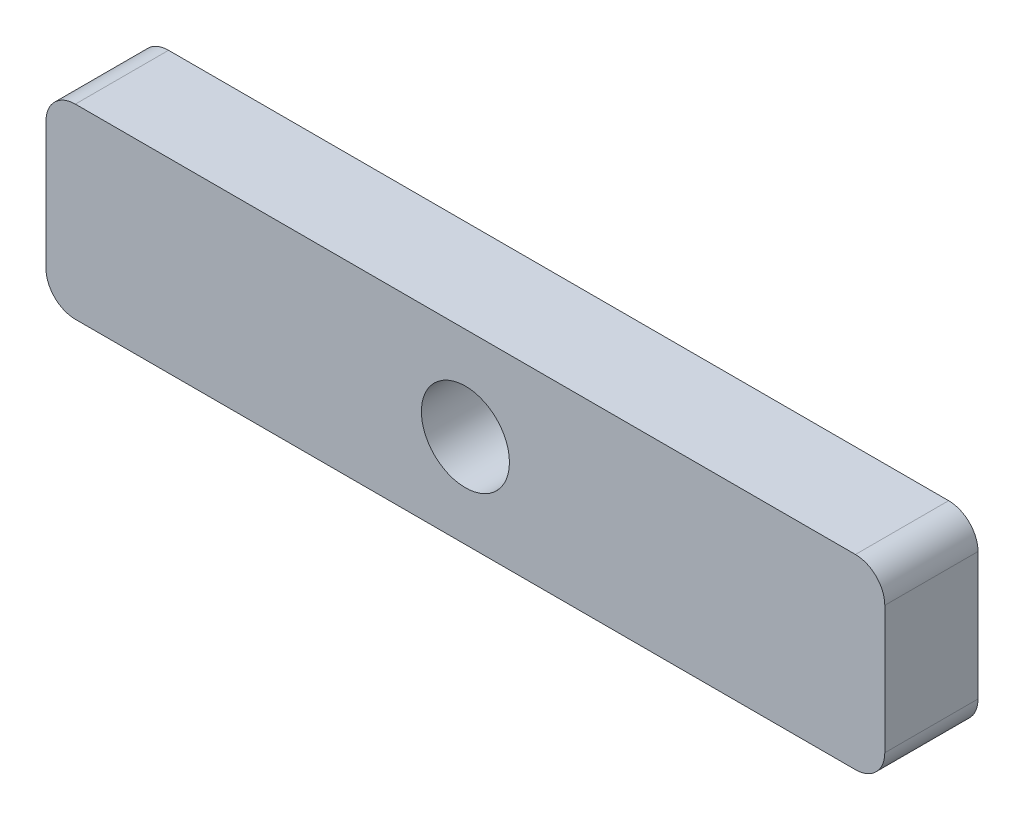
ISO-10303-21;
HEADER;
FILE_DESCRIPTION(('STEP AP214'),'2;1');
FILE_NAME('part.step','',(''),(''),'','','');
FILE_SCHEMA(('AUTOMOTIVE_DESIGN { 1 0 10303 214 1 1 1 1 }'));
ENDSEC;
DATA;
#1=APPLICATION_CONTEXT('core data for automotive mechanical design processes');
#2=APPLICATION_PROTOCOL_DEFINITION('international standard','automotive_design',2000,#1);
#3=PRODUCT_CONTEXT('',#1,'mechanical');
#4=PRODUCT('Part','Part','',(#3));
#5=PRODUCT_RELATED_PRODUCT_CATEGORY('part','',(#4));
#6=PRODUCT_DEFINITION_FORMATION('','',#4);
#7=PRODUCT_DEFINITION_CONTEXT('part definition',#1,'design');
#8=PRODUCT_DEFINITION('design','',#6,#7);
#9=PRODUCT_DEFINITION_SHAPE('','',#8);
#10=(LENGTH_UNIT() NAMED_UNIT(*) SI_UNIT(.MILLI.,.METRE.));
#11=(NAMED_UNIT(*) PLANE_ANGLE_UNIT() SI_UNIT($,.RADIAN.));
#12=(NAMED_UNIT(*) SI_UNIT($,.STERADIAN.) SOLID_ANGLE_UNIT());
#13=UNCERTAINTY_MEASURE_WITH_UNIT(LENGTH_MEASURE(1.E-05),#10,'distance_accuracy_value','');
#14=(GEOMETRIC_REPRESENTATION_CONTEXT(3) GLOBAL_UNCERTAINTY_ASSIGNED_CONTEXT((#13)) GLOBAL_UNIT_ASSIGNED_CONTEXT((#10,
#11,#12)) REPRESENTATION_CONTEXT('',''));
#15=CARTESIAN_POINT('',(0.,0.,0.));
#16=DIRECTION('',(0.,0.,1.));
#17=DIRECTION('',(1.,0.,0.));
#18=AXIS2_PLACEMENT_3D('',#15,#16,#17);
#19=CARTESIAN_POINT('',(0.,0.,6.35));
#20=DIRECTION('',(0.,0.,-1.));
#21=DIRECTION('',(-1.,0.,0.));
#22=AXIS2_PLACEMENT_3D('',#19,#20,#21);
#23=PLANE('',#22);
#24=DIRECTION('',(0.,1.,0.));
#25=VECTOR('',#24,1.);
#26=CARTESIAN_POINT('',(28.575,-6.35,6.35));
#27=LINE('',#26,#25);
#28=CARTESIAN_POINT('',(28.575,-4.35,6.35));
#29=VERTEX_POINT('',#28);
#30=CARTESIAN_POINT('',(28.575,4.35,6.35));
#31=VERTEX_POINT('',#30);
#32=EDGE_CURVE('E145',#29,#31,#27,.T.);
#33=ORIENTED_EDGE('',*,*,#32,.T.);
#34=CARTESIAN_POINT('',(26.575,4.35,6.35));
#35=DIRECTION('',(0.,0.,-1.));
#36=DIRECTION('',(-1.,0.,0.));
#37=AXIS2_PLACEMENT_3D('',#34,#35,#36);
#38=CIRCLE('',#37,2.);
#39=CARTESIAN_POINT('',(26.575,6.35,6.35));
#40=VERTEX_POINT('',#39);
#41=EDGE_CURVE('E160',#31,#40,#38,.F.);
#42=ORIENTED_EDGE('',*,*,#41,.T.);
#43=DIRECTION('',(-1.,0.,0.));
#44=VECTOR('',#43,1.);
#45=CARTESIAN_POINT('',(-28.575,6.35,6.35));
#46=LINE('',#45,#44);
#47=CARTESIAN_POINT('',(-26.575,6.35,6.35));
#48=VERTEX_POINT('',#47);
#49=EDGE_CURVE('E127',#40,#48,#46,.T.);
#50=ORIENTED_EDGE('',*,*,#49,.T.);
#51=CARTESIAN_POINT('',(-26.575,4.35,6.35));
#52=DIRECTION('',(0.,0.,-1.));
#53=DIRECTION('',(-1.,0.,0.));
#54=AXIS2_PLACEMENT_3D('',#51,#52,#53);
#55=CIRCLE('',#54,2.);
#56=CARTESIAN_POINT('',(-28.575,4.35,6.35));
#57=VERTEX_POINT('',#56);
#58=EDGE_CURVE('E155',#48,#57,#55,.F.);
#59=ORIENTED_EDGE('',*,*,#58,.T.);
#60=DIRECTION('',(0.,-1.,0.));
#61=VECTOR('',#60,1.);
#62=CARTESIAN_POINT('',(-28.575,-6.35,6.35));
#63=LINE('',#62,#61);
#64=CARTESIAN_POINT('',(-28.575,-4.35,6.35));
#65=VERTEX_POINT('',#64);
#66=EDGE_CURVE('E171',#57,#65,#63,.T.);
#67=ORIENTED_EDGE('',*,*,#66,.T.);
#68=CARTESIAN_POINT('',(-26.575,-4.35,6.35));
#69=DIRECTION('',(0.,0.,-1.));
#70=DIRECTION('',(-1.,0.,0.));
#71=AXIS2_PLACEMENT_3D('',#68,#69,#70);
#72=CIRCLE('',#71,2.);
#73=CARTESIAN_POINT('',(-26.575,-6.35,6.35));
#74=VERTEX_POINT('',#73);
#75=EDGE_CURVE('E63',#65,#74,#72,.F.);
#76=ORIENTED_EDGE('',*,*,#75,.T.);
#77=DIRECTION('',(1.,0.,0.));
#78=VECTOR('',#77,1.);
#79=CARTESIAN_POINT('',(-28.575,-6.35,6.35));
#80=LINE('',#79,#78);
#81=CARTESIAN_POINT('',(26.575,-6.35,6.35));
#82=VERTEX_POINT('',#81);
#83=EDGE_CURVE('E146',#74,#82,#80,.T.);
#84=ORIENTED_EDGE('',*,*,#83,.T.);
#85=CARTESIAN_POINT('',(26.575,-4.35,6.35));
#86=DIRECTION('',(0.,0.,-1.));
#87=DIRECTION('',(-1.,0.,0.));
#88=AXIS2_PLACEMENT_3D('',#85,#86,#87);
#89=CIRCLE('',#88,2.);
#90=EDGE_CURVE('E158',#82,#29,#89,.F.);
#91=ORIENTED_EDGE('',*,*,#90,.T.);
#92=EDGE_LOOP('',(#33,#42,#50,#59,#67,#76,#84,#91));
#93=FACE_BOUND('',#92,.T.);
#94=CARTESIAN_POINT('',(0.,0.,6.35));
#95=DIRECTION('',(0.,0.,1.));
#96=DIRECTION('',(1.,0.,0.));
#97=AXIS2_PLACEMENT_3D('',#94,#95,#96);
#98=CIRCLE('',#97,3.);
#99=CARTESIAN_POINT('',(2.99999999999999,0.,6.35));
#100=VERTEX_POINT('',#99);
#101=EDGE_CURVE('E140',#100,#100,#98,.T.);
#102=ORIENTED_EDGE('',*,*,#101,.F.);
#103=EDGE_LOOP('',(#102));
#104=FACE_BOUND('',#103,.T.);
#105=ADVANCED_FACE('F41',(#93,#104),#23,.F.);
#106=CARTESIAN_POINT('',(0.,0.,0.));
#107=DIRECTION('',(0.,0.,-1.));
#108=DIRECTION('',(-1.,0.,0.));
#109=AXIS2_PLACEMENT_3D('',#106,#107,#108);
#110=PLANE('',#109);
#111=DIRECTION('',(-1.,0.,0.));
#112=VECTOR('',#111,1.);
#113=CARTESIAN_POINT('',(-28.575,6.35,0.));
#114=LINE('',#113,#112);
#115=CARTESIAN_POINT('',(26.575,6.35,0.));
#116=VERTEX_POINT('',#115);
#117=CARTESIAN_POINT('',(-26.575,6.35,0.));
#118=VERTEX_POINT('',#117);
#119=EDGE_CURVE('E124',#116,#118,#114,.T.);
#120=ORIENTED_EDGE('',*,*,#119,.F.);
#121=CARTESIAN_POINT('',(26.575,4.35,0.));
#122=DIRECTION('',(0.,0.,-1.));
#123=DIRECTION('',(-1.,0.,0.));
#124=AXIS2_PLACEMENT_3D('',#121,#122,#123);
#125=CIRCLE('',#124,2.);
#126=CARTESIAN_POINT('',(28.575,4.35,0.));
#127=VERTEX_POINT('',#126);
#128=EDGE_CURVE('E107',#116,#127,#125,.T.);
#129=ORIENTED_EDGE('',*,*,#128,.T.);
#130=DIRECTION('',(0.,1.,0.));
#131=VECTOR('',#130,1.);
#132=CARTESIAN_POINT('',(28.575,-6.35,0.));
#133=LINE('',#132,#131);
#134=CARTESIAN_POINT('',(28.575,-4.35,0.));
#135=VERTEX_POINT('',#134);
#136=EDGE_CURVE('E135',#135,#127,#133,.T.);
#137=ORIENTED_EDGE('',*,*,#136,.F.);
#138=CARTESIAN_POINT('',(26.575,-4.35,0.));
#139=DIRECTION('',(0.,0.,-1.));
#140=DIRECTION('',(-1.,0.,0.));
#141=AXIS2_PLACEMENT_3D('',#138,#139,#140);
#142=CIRCLE('',#141,2.);
#143=CARTESIAN_POINT('',(26.575,-6.35,0.));
#144=VERTEX_POINT('',#143);
#145=EDGE_CURVE('E118',#135,#144,#142,.T.);
#146=ORIENTED_EDGE('',*,*,#145,.T.);
#147=DIRECTION('',(1.,0.,0.));
#148=VECTOR('',#147,1.);
#149=CARTESIAN_POINT('',(-28.575,-6.35,0.));
#150=LINE('',#149,#148);
#151=CARTESIAN_POINT('',(-26.575,-6.35,0.));
#152=VERTEX_POINT('',#151);
#153=EDGE_CURVE('E138',#152,#144,#150,.T.);
#154=ORIENTED_EDGE('',*,*,#153,.F.);
#155=CARTESIAN_POINT('',(-26.575,-4.35,0.));
#156=DIRECTION('',(0.,0.,-1.));
#157=DIRECTION('',(-1.,0.,0.));
#158=AXIS2_PLACEMENT_3D('',#155,#156,#157);
#159=CIRCLE('',#158,2.);
#160=CARTESIAN_POINT('',(-28.575,-4.35,0.));
#161=VERTEX_POINT('',#160);
#162=EDGE_CURVE('E149',#152,#161,#159,.T.);
#163=ORIENTED_EDGE('',*,*,#162,.T.);
#164=DIRECTION('',(0.,-1.,0.));
#165=VECTOR('',#164,1.);
#166=CARTESIAN_POINT('',(-28.575,-6.35,0.));
#167=LINE('',#166,#165);
#168=CARTESIAN_POINT('',(-28.575,4.35,0.));
#169=VERTEX_POINT('',#168);
#170=EDGE_CURVE('E134',#169,#161,#167,.T.);
#171=ORIENTED_EDGE('',*,*,#170,.F.);
#172=CARTESIAN_POINT('',(-26.575,4.35,0.));
#173=DIRECTION('',(0.,0.,-1.));
#174=DIRECTION('',(-1.,0.,0.));
#175=AXIS2_PLACEMENT_3D('',#172,#173,#174);
#176=CIRCLE('',#175,2.);
#177=EDGE_CURVE('E128',#169,#118,#176,.T.);
#178=ORIENTED_EDGE('',*,*,#177,.T.);
#179=EDGE_LOOP('',(#120,#129,#137,#146,#154,#163,#171,#178));
#180=FACE_BOUND('',#179,.T.);
#181=CARTESIAN_POINT('',(0.,0.,0.));
#182=DIRECTION('',(0.,0.,1.));
#183=DIRECTION('',(1.,0.,0.));
#184=AXIS2_PLACEMENT_3D('',#181,#182,#183);
#185=CIRCLE('',#184,3.);
#186=CARTESIAN_POINT('',(2.99999999999999,0.,0.));
#187=VERTEX_POINT('',#186);
#188=EDGE_CURVE('E185',#187,#187,#185,.T.);
#189=ORIENTED_EDGE('',*,*,#188,.T.);
#190=EDGE_LOOP('',(#189));
#191=FACE_BOUND('',#190,.T.);
#192=ADVANCED_FACE('F131',(#180,#191),#110,.T.);
#193=CARTESIAN_POINT('',(28.575,-6.35,6.35));
#194=DIRECTION('',(-1.,0.,0.));
#195=DIRECTION('',(0.,0.,1.));
#196=AXIS2_PLACEMENT_3D('',#193,#194,#195);
#197=PLANE('',#196);
#198=ORIENTED_EDGE('',*,*,#136,.T.);
#199=DIRECTION('',(0.,0.,-1.));
#200=VECTOR('',#199,1.);
#201=CARTESIAN_POINT('',(28.575,4.35,6.35));
#202=LINE('',#201,#200);
#203=EDGE_CURVE('E112',#127,#31,#202,.F.);
#204=ORIENTED_EDGE('',*,*,#203,.T.);
#205=ORIENTED_EDGE('',*,*,#32,.F.);
#206=DIRECTION('',(0.,0.,-1.));
#207=VECTOR('',#206,1.);
#208=CARTESIAN_POINT('',(28.575,-4.35,6.35));
#209=LINE('',#208,#207);
#210=EDGE_CURVE('E117',#29,#135,#209,.T.);
#211=ORIENTED_EDGE('',*,*,#210,.T.);
#212=EDGE_LOOP('',(#198,#204,#205,#211));
#213=FACE_BOUND('',#212,.T.);
#214=ADVANCED_FACE('F199',(#213),#197,.F.);
#215=CARTESIAN_POINT('',(-28.575,6.35,6.35));
#216=DIRECTION('',(0.,-1.,0.));
#217=DIRECTION('',(0.,0.,-1.));
#218=AXIS2_PLACEMENT_3D('',#215,#216,#217);
#219=PLANE('',#218);
#220=ORIENTED_EDGE('',*,*,#49,.F.);
#221=DIRECTION('',(0.,0.,-1.));
#222=VECTOR('',#221,1.);
#223=CARTESIAN_POINT('',(26.575,6.35,6.35));
#224=LINE('',#223,#222);
#225=EDGE_CURVE('E111',#40,#116,#224,.T.);
#226=ORIENTED_EDGE('',*,*,#225,.T.);
#227=ORIENTED_EDGE('',*,*,#119,.T.);
#228=DIRECTION('',(0.,0.,-1.));
#229=VECTOR('',#228,1.);
#230=CARTESIAN_POINT('',(-26.575,6.35,6.35));
#231=LINE('',#230,#229);
#232=EDGE_CURVE('E129',#118,#48,#231,.F.);
#233=ORIENTED_EDGE('',*,*,#232,.T.);
#234=EDGE_LOOP('',(#220,#226,#227,#233));
#235=FACE_BOUND('',#234,.T.);
#236=ADVANCED_FACE('F123',(#235),#219,.F.);
#237=CARTESIAN_POINT('',(-28.575,-6.35,6.35));
#238=DIRECTION('',(1.,0.,0.));
#239=DIRECTION('',(0.,0.,-1.));
#240=AXIS2_PLACEMENT_3D('',#237,#238,#239);
#241=PLANE('',#240);
#242=ORIENTED_EDGE('',*,*,#170,.T.);
#243=DIRECTION('',(0.,0.,-1.));
#244=VECTOR('',#243,1.);
#245=CARTESIAN_POINT('',(-28.575,-4.35,6.35));
#246=LINE('',#245,#244);
#247=EDGE_CURVE('E11',#161,#65,#246,.F.);
#248=ORIENTED_EDGE('',*,*,#247,.T.);
#249=ORIENTED_EDGE('',*,*,#66,.F.);
#250=DIRECTION('',(0.,0.,-1.));
#251=VECTOR('',#250,1.);
#252=CARTESIAN_POINT('',(-28.575,4.35,6.35));
#253=LINE('',#252,#251);
#254=EDGE_CURVE('E49',#57,#169,#253,.T.);
#255=ORIENTED_EDGE('',*,*,#254,.T.);
#256=EDGE_LOOP('',(#242,#248,#249,#255));
#257=FACE_BOUND('',#256,.T.);
#258=ADVANCED_FACE('F169',(#257),#241,.F.);
#259=CARTESIAN_POINT('',(-28.575,-6.35,6.35));
#260=DIRECTION('',(0.,1.,0.));
#261=DIRECTION('',(0.,0.,1.));
#262=AXIS2_PLACEMENT_3D('',#259,#260,#261);
#263=PLANE('',#262);
#264=ORIENTED_EDGE('',*,*,#153,.T.);
#265=DIRECTION('',(0.,0.,-1.));
#266=VECTOR('',#265,1.);
#267=CARTESIAN_POINT('',(26.575,-6.35,6.35));
#268=LINE('',#267,#266);
#269=EDGE_CURVE('E56',#144,#82,#268,.F.);
#270=ORIENTED_EDGE('',*,*,#269,.T.);
#271=ORIENTED_EDGE('',*,*,#83,.F.);
#272=DIRECTION('',(0.,0.,-1.));
#273=VECTOR('',#272,1.);
#274=CARTESIAN_POINT('',(-26.575,-6.35,6.35));
#275=LINE('',#274,#273);
#276=EDGE_CURVE('E162',#74,#152,#275,.T.);
#277=ORIENTED_EDGE('',*,*,#276,.T.);
#278=EDGE_LOOP('',(#264,#270,#271,#277));
#279=FACE_BOUND('',#278,.T.);
#280=ADVANCED_FACE('F178',(#279),#263,.F.);
#281=CARTESIAN_POINT('',(0.,0.,6.35));
#282=DIRECTION('',(0.,0.,-1.));
#283=DIRECTION('',(-1.,0.,0.));
#284=AXIS2_PLACEMENT_3D('',#281,#282,#283);
#285=CYLINDRICAL_SURFACE('',#284,3.);
#286=ORIENTED_EDGE('',*,*,#101,.T.);
#287=EDGE_LOOP('',(#286));
#288=FACE_BOUND('',#287,.T.);
#289=ORIENTED_EDGE('',*,*,#188,.F.);
#290=EDGE_LOOP('',(#289));
#291=FACE_BOUND('',#290,.T.);
#292=ADVANCED_FACE('F191',(#288,#291),#285,.F.);
#293=CARTESIAN_POINT('',(26.575,4.35,6.35));
#294=DIRECTION('',(0.,0.,-1.));
#295=DIRECTION('',(-1.,0.,0.));
#296=AXIS2_PLACEMENT_3D('',#293,#294,#295);
#297=CYLINDRICAL_SURFACE('',#296,2.);
#298=ORIENTED_EDGE('',*,*,#41,.F.);
#299=ORIENTED_EDGE('',*,*,#203,.F.);
#300=ORIENTED_EDGE('',*,*,#128,.F.);
#301=ORIENTED_EDGE('',*,*,#225,.F.);
#302=EDGE_LOOP('',(#298,#299,#300,#301));
#303=FACE_BOUND('',#302,.T.);
#304=ADVANCED_FACE('F110',(#303),#297,.T.);
#305=CARTESIAN_POINT('',(26.575,-4.35,6.35));
#306=DIRECTION('',(0.,0.,-1.));
#307=DIRECTION('',(-1.,0.,0.));
#308=AXIS2_PLACEMENT_3D('',#305,#306,#307);
#309=CYLINDRICAL_SURFACE('',#308,2.);
#310=ORIENTED_EDGE('',*,*,#90,.F.);
#311=ORIENTED_EDGE('',*,*,#269,.F.);
#312=ORIENTED_EDGE('',*,*,#145,.F.);
#313=ORIENTED_EDGE('',*,*,#210,.F.);
#314=EDGE_LOOP('',(#310,#311,#312,#313));
#315=FACE_BOUND('',#314,.T.);
#316=ADVANCED_FACE('F214',(#315),#309,.T.);
#317=CARTESIAN_POINT('',(-26.575,-4.35,6.35));
#318=DIRECTION('',(0.,0.,-1.));
#319=DIRECTION('',(-1.,0.,0.));
#320=AXIS2_PLACEMENT_3D('',#317,#318,#319);
#321=CYLINDRICAL_SURFACE('',#320,2.);
#322=ORIENTED_EDGE('',*,*,#75,.F.);
#323=ORIENTED_EDGE('',*,*,#247,.F.);
#324=ORIENTED_EDGE('',*,*,#162,.F.);
#325=ORIENTED_EDGE('',*,*,#276,.F.);
#326=EDGE_LOOP('',(#322,#323,#324,#325));
#327=FACE_BOUND('',#326,.T.);
#328=ADVANCED_FACE('F177',(#327),#321,.T.);
#329=CARTESIAN_POINT('',(-26.575,4.35,6.35));
#330=DIRECTION('',(0.,0.,-1.));
#331=DIRECTION('',(-1.,0.,0.));
#332=AXIS2_PLACEMENT_3D('',#329,#330,#331);
#333=CYLINDRICAL_SURFACE('',#332,2.);
#334=ORIENTED_EDGE('',*,*,#58,.F.);
#335=ORIENTED_EDGE('',*,*,#232,.F.);
#336=ORIENTED_EDGE('',*,*,#177,.F.);
#337=ORIENTED_EDGE('',*,*,#254,.F.);
#338=EDGE_LOOP('',(#334,#335,#336,#337));
#339=FACE_BOUND('',#338,.T.);
#340=ADVANCED_FACE('F43',(#339),#333,.T.);
#341=CLOSED_SHELL('',(#105,#192,#214,#236,#258,#280,#292,#304,#316,#328,#340));
#342=MANIFOLD_SOLID_BREP('B2',#341);
#343=ADVANCED_BREP_SHAPE_REPRESENTATION('',(#18,#342),#14);
#344=SHAPE_DEFINITION_REPRESENTATION(#9,#343);
ENDSEC;
END-ISO-10303-21;
